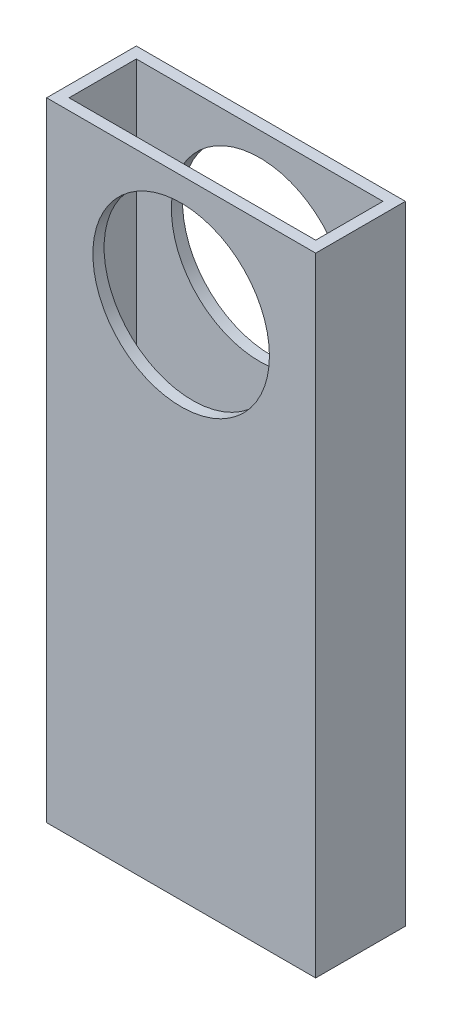
ISO-10303-21;
HEADER;
FILE_DESCRIPTION(('STEP AP214'),'2;1');
FILE_NAME('part.step','',(''),(''),'','','');
FILE_SCHEMA(('AUTOMOTIVE_DESIGN { 1 0 10303 214 1 1 1 1 }'));
ENDSEC;
DATA;
#1=APPLICATION_CONTEXT('core data for automotive mechanical design processes');
#2=APPLICATION_PROTOCOL_DEFINITION('international standard','automotive_design',2000,#1);
#3=PRODUCT_CONTEXT('',#1,'mechanical');
#4=PRODUCT('Part','Part','',(#3));
#5=PRODUCT_RELATED_PRODUCT_CATEGORY('part','',(#4));
#6=PRODUCT_DEFINITION_FORMATION('','',#4);
#7=PRODUCT_DEFINITION_CONTEXT('part definition',#1,'design');
#8=PRODUCT_DEFINITION('design','',#6,#7);
#9=PRODUCT_DEFINITION_SHAPE('','',#8);
#10=(LENGTH_UNIT() NAMED_UNIT(*) SI_UNIT(.MILLI.,.METRE.));
#11=(NAMED_UNIT(*) PLANE_ANGLE_UNIT() SI_UNIT($,.RADIAN.));
#12=(NAMED_UNIT(*) SI_UNIT($,.STERADIAN.) SOLID_ANGLE_UNIT());
#13=UNCERTAINTY_MEASURE_WITH_UNIT(LENGTH_MEASURE(1.E-05),#10,'distance_accuracy_value','');
#14=(GEOMETRIC_REPRESENTATION_CONTEXT(3) GLOBAL_UNCERTAINTY_ASSIGNED_CONTEXT((#13)) GLOBAL_UNIT_ASSIGNED_CONTEXT((#10,
#11,#12)) REPRESENTATION_CONTEXT('',''));
#15=CARTESIAN_POINT('',(0.,0.,0.));
#16=DIRECTION('',(0.,0.,1.));
#17=DIRECTION('',(1.,0.,0.));
#18=AXIS2_PLACEMENT_3D('',#15,#16,#17);
#19=CARTESIAN_POINT('',(0.,177.8,0.));
#20=DIRECTION('',(0.,1.,0.));
#21=DIRECTION('',(0.,0.,1.));
#22=AXIS2_PLACEMENT_3D('',#19,#20,#21);
#23=PLANE('',#22);
#24=DIRECTION('',(0.,0.,1.));
#25=VECTOR('',#24,1.);
#26=CARTESIAN_POINT('',(-38.1,177.8,12.7));
#27=LINE('',#26,#25);
#28=CARTESIAN_POINT('',(-38.1,177.8,-12.7));
#29=VERTEX_POINT('',#28);
#30=CARTESIAN_POINT('',(-38.1,177.8,12.7));
#31=VERTEX_POINT('',#30);
#32=EDGE_CURVE('E143',#29,#31,#27,.T.);
#33=ORIENTED_EDGE('',*,*,#32,.T.);
#34=DIRECTION('',(1.,0.,0.));
#35=VECTOR('',#34,1.);
#36=CARTESIAN_POINT('',(38.1,177.8,12.7));
#37=LINE('',#36,#35);
#38=CARTESIAN_POINT('',(38.1,177.8,12.7));
#39=VERTEX_POINT('',#38);
#40=EDGE_CURVE('E146',#31,#39,#37,.T.);
#41=ORIENTED_EDGE('',*,*,#40,.T.);
#42=DIRECTION('',(0.,0.,-1.));
#43=VECTOR('',#42,1.);
#44=CARTESIAN_POINT('',(38.1,177.8,12.7));
#45=LINE('',#44,#43);
#46=CARTESIAN_POINT('',(38.1,177.8,-12.7));
#47=VERTEX_POINT('',#46);
#48=EDGE_CURVE('E149',#39,#47,#45,.T.);
#49=ORIENTED_EDGE('',*,*,#48,.T.);
#50=DIRECTION('',(-1.,0.,0.));
#51=VECTOR('',#50,1.);
#52=CARTESIAN_POINT('',(38.1,177.8,-12.7));
#53=LINE('',#52,#51);
#54=EDGE_CURVE('E151',#47,#29,#53,.T.);
#55=ORIENTED_EDGE('',*,*,#54,.T.);
#56=EDGE_LOOP('',(#33,#41,#49,#55));
#57=FACE_BOUND('',#56,.T.);
#58=DIRECTION('',(-1.,0.,0.));
#59=VECTOR('',#58,1.);
#60=CARTESIAN_POINT('',(34.925,177.8,-9.52500000000001));
#61=LINE('',#60,#59);
#62=CARTESIAN_POINT('',(34.925,177.8,-9.52500000000001));
#63=VERTEX_POINT('',#62);
#64=CARTESIAN_POINT('',(-34.925,177.8,-9.525));
#65=VERTEX_POINT('',#64);
#66=EDGE_CURVE('E113',#63,#65,#61,.T.);
#67=ORIENTED_EDGE('',*,*,#66,.F.);
#68=DIRECTION('',(0.,0.,-1.));
#69=VECTOR('',#68,1.);
#70=CARTESIAN_POINT('',(34.925,177.8,9.52499999999999));
#71=LINE('',#70,#69);
#72=CARTESIAN_POINT('',(34.925,177.8,9.52499999999999));
#73=VERTEX_POINT('',#72);
#74=EDGE_CURVE('E105',#73,#63,#71,.T.);
#75=ORIENTED_EDGE('',*,*,#74,.F.);
#76=DIRECTION('',(1.,0.,0.));
#77=VECTOR('',#76,1.);
#78=CARTESIAN_POINT('',(34.925,177.8,9.52499999999999));
#79=LINE('',#78,#77);
#80=CARTESIAN_POINT('',(-34.925,177.8,9.525));
#81=VERTEX_POINT('',#80);
#82=EDGE_CURVE('E127',#81,#73,#79,.T.);
#83=ORIENTED_EDGE('',*,*,#82,.F.);
#84=DIRECTION('',(0.,0.,1.));
#85=VECTOR('',#84,1.);
#86=CARTESIAN_POINT('',(-34.925,177.8,9.525));
#87=LINE('',#86,#85);
#88=EDGE_CURVE('E125',#65,#81,#87,.T.);
#89=ORIENTED_EDGE('',*,*,#88,.F.);
#90=EDGE_LOOP('',(#67,#75,#83,#89));
#91=FACE_BOUND('',#90,.T.);
#92=ADVANCED_FACE('F39',(#57,#91),#23,.T.);
#93=CARTESIAN_POINT('',(0.,0.,0.));
#94=DIRECTION('',(0.,1.,0.));
#95=DIRECTION('',(0.,0.,1.));
#96=AXIS2_PLACEMENT_3D('',#93,#94,#95);
#97=PLANE('',#96);
#98=DIRECTION('',(0.,0.,1.));
#99=VECTOR('',#98,1.);
#100=CARTESIAN_POINT('',(-38.1,0.,12.7));
#101=LINE('',#100,#99);
#102=CARTESIAN_POINT('',(-38.1,0.,-12.7));
#103=VERTEX_POINT('',#102);
#104=CARTESIAN_POINT('',(-38.1,0.,12.7));
#105=VERTEX_POINT('',#104);
#106=EDGE_CURVE('E121',#103,#105,#101,.T.);
#107=ORIENTED_EDGE('',*,*,#106,.F.);
#108=DIRECTION('',(-1.,0.,0.));
#109=VECTOR('',#108,1.);
#110=CARTESIAN_POINT('',(38.1,0.,-12.7));
#111=LINE('',#110,#109);
#112=CARTESIAN_POINT('',(38.1,0.,-12.7));
#113=VERTEX_POINT('',#112);
#114=EDGE_CURVE('E147',#113,#103,#111,.T.);
#115=ORIENTED_EDGE('',*,*,#114,.F.);
#116=DIRECTION('',(0.,0.,-1.));
#117=VECTOR('',#116,1.);
#118=CARTESIAN_POINT('',(38.1,0.,12.7));
#119=LINE('',#118,#117);
#120=CARTESIAN_POINT('',(38.1,0.,12.7));
#121=VERTEX_POINT('',#120);
#122=EDGE_CURVE('E158',#121,#113,#119,.T.);
#123=ORIENTED_EDGE('',*,*,#122,.F.);
#124=DIRECTION('',(1.,0.,0.));
#125=VECTOR('',#124,1.);
#126=CARTESIAN_POINT('',(38.1,0.,12.7));
#127=LINE('',#126,#125);
#128=EDGE_CURVE('E156',#105,#121,#127,.T.);
#129=ORIENTED_EDGE('',*,*,#128,.F.);
#130=EDGE_LOOP('',(#107,#115,#123,#129));
#131=FACE_BOUND('',#130,.T.);
#132=DIRECTION('',(0.,0.,-1.));
#133=VECTOR('',#132,1.);
#134=CARTESIAN_POINT('',(34.925,0.,9.52499999999999));
#135=LINE('',#134,#133);
#136=CARTESIAN_POINT('',(34.925,0.,9.52499999999999));
#137=VERTEX_POINT('',#136);
#138=CARTESIAN_POINT('',(34.925,0.,-9.52500000000001));
#139=VERTEX_POINT('',#138);
#140=EDGE_CURVE('E63',#137,#139,#135,.T.);
#141=ORIENTED_EDGE('',*,*,#140,.T.);
#142=DIRECTION('',(-1.,0.,0.));
#143=VECTOR('',#142,1.);
#144=CARTESIAN_POINT('',(34.925,0.,-9.52500000000001));
#145=LINE('',#144,#143);
#146=CARTESIAN_POINT('',(-34.925,0.,-9.525));
#147=VERTEX_POINT('',#146);
#148=EDGE_CURVE('E120',#139,#147,#145,.T.);
#149=ORIENTED_EDGE('',*,*,#148,.T.);
#150=DIRECTION('',(0.,0.,1.));
#151=VECTOR('',#150,1.);
#152=CARTESIAN_POINT('',(-34.925,0.,9.525));
#153=LINE('',#152,#151);
#154=CARTESIAN_POINT('',(-34.925,0.,9.525));
#155=VERTEX_POINT('',#154);
#156=EDGE_CURVE('E135',#147,#155,#153,.T.);
#157=ORIENTED_EDGE('',*,*,#156,.T.);
#158=DIRECTION('',(1.,0.,0.));
#159=VECTOR('',#158,1.);
#160=CARTESIAN_POINT('',(34.925,0.,9.52499999999999));
#161=LINE('',#160,#159);
#162=EDGE_CURVE('E114',#155,#137,#161,.T.);
#163=ORIENTED_EDGE('',*,*,#162,.T.);
#164=EDGE_LOOP('',(#141,#149,#157,#163));
#165=FACE_BOUND('',#164,.T.);
#166=ADVANCED_FACE('F177',(#131,#165),#97,.F.);
#167=CARTESIAN_POINT('',(-38.1,177.8,12.7));
#168=DIRECTION('',(1.,0.,0.));
#169=DIRECTION('',(0.,0.,-1.));
#170=AXIS2_PLACEMENT_3D('',#167,#168,#169);
#171=PLANE('',#170);
#172=ORIENTED_EDGE('',*,*,#106,.T.);
#173=DIRECTION('',(0.,-1.,0.));
#174=VECTOR('',#173,1.);
#175=CARTESIAN_POINT('',(-38.1,177.8,12.7));
#176=LINE('',#175,#174);
#177=EDGE_CURVE('E11',#31,#105,#176,.T.);
#178=ORIENTED_EDGE('',*,*,#177,.F.);
#179=ORIENTED_EDGE('',*,*,#32,.F.);
#180=DIRECTION('',(0.,-1.,0.));
#181=VECTOR('',#180,1.);
#182=CARTESIAN_POINT('',(-38.1,177.8,-12.7));
#183=LINE('',#182,#181);
#184=EDGE_CURVE('E153',#29,#103,#183,.T.);
#185=ORIENTED_EDGE('',*,*,#184,.T.);
#186=EDGE_LOOP('',(#172,#178,#179,#185));
#187=FACE_BOUND('',#186,.T.);
#188=ADVANCED_FACE('F41',(#187),#171,.F.);
#189=CARTESIAN_POINT('',(38.1,177.8,12.7));
#190=DIRECTION('',(0.,0.,-1.));
#191=DIRECTION('',(-1.,0.,0.));
#192=AXIS2_PLACEMENT_3D('',#189,#190,#191);
#193=PLANE('',#192);
#194=CARTESIAN_POINT('',(0.,146.05,12.7));
#195=DIRECTION('',(0.,0.,1.));
#196=DIRECTION('',(1.,0.,0.));
#197=AXIS2_PLACEMENT_3D('',#194,#195,#196);
#198=CIRCLE('',#197,25.);
#199=CARTESIAN_POINT('',(25.,146.05,12.7));
#200=VERTEX_POINT('',#199);
#201=EDGE_CURVE('E214',#200,#200,#198,.T.);
#202=ORIENTED_EDGE('',*,*,#201,.F.);
#203=EDGE_LOOP('',(#202));
#204=FACE_BOUND('',#203,.T.);
#205=ORIENTED_EDGE('',*,*,#128,.T.);
#206=DIRECTION('',(0.,-1.,0.));
#207=VECTOR('',#206,1.);
#208=CARTESIAN_POINT('',(38.1,177.8,12.7));
#209=LINE('',#208,#207);
#210=EDGE_CURVE('E48',#39,#121,#209,.T.);
#211=ORIENTED_EDGE('',*,*,#210,.F.);
#212=ORIENTED_EDGE('',*,*,#40,.F.);
#213=ORIENTED_EDGE('',*,*,#177,.T.);
#214=EDGE_LOOP('',(#205,#211,#212,#213));
#215=FACE_BOUND('',#214,.T.);
#216=ADVANCED_FACE('F187',(#204,#215),#193,.F.);
#217=CARTESIAN_POINT('',(38.1,177.8,12.7));
#218=DIRECTION('',(-1.,0.,0.));
#219=DIRECTION('',(0.,0.,1.));
#220=AXIS2_PLACEMENT_3D('',#217,#218,#219);
#221=PLANE('',#220);
#222=ORIENTED_EDGE('',*,*,#122,.T.);
#223=DIRECTION('',(0.,-1.,0.));
#224=VECTOR('',#223,1.);
#225=CARTESIAN_POINT('',(38.1,177.8,-12.7));
#226=LINE('',#225,#224);
#227=EDGE_CURVE('E163',#47,#113,#226,.T.);
#228=ORIENTED_EDGE('',*,*,#227,.F.);
#229=ORIENTED_EDGE('',*,*,#48,.F.);
#230=ORIENTED_EDGE('',*,*,#210,.T.);
#231=EDGE_LOOP('',(#222,#228,#229,#230));
#232=FACE_BOUND('',#231,.T.);
#233=ADVANCED_FACE('F171',(#232),#221,.F.);
#234=CARTESIAN_POINT('',(38.1,177.8,-12.7));
#235=DIRECTION('',(0.,0.,1.));
#236=DIRECTION('',(1.,0.,0.));
#237=AXIS2_PLACEMENT_3D('',#234,#235,#236);
#238=PLANE('',#237);
#239=CARTESIAN_POINT('',(0.,146.05,-12.7));
#240=DIRECTION('',(0.,0.,1.));
#241=DIRECTION('',(1.,0.,0.));
#242=AXIS2_PLACEMENT_3D('',#239,#240,#241);
#243=CIRCLE('',#242,25.);
#244=CARTESIAN_POINT('',(25.,146.05,-12.7));
#245=VERTEX_POINT('',#244);
#246=EDGE_CURVE('E212',#245,#245,#243,.T.);
#247=ORIENTED_EDGE('',*,*,#246,.T.);
#248=EDGE_LOOP('',(#247));
#249=FACE_BOUND('',#248,.T.);
#250=ORIENTED_EDGE('',*,*,#114,.T.);
#251=ORIENTED_EDGE('',*,*,#184,.F.);
#252=ORIENTED_EDGE('',*,*,#54,.F.);
#253=ORIENTED_EDGE('',*,*,#227,.T.);
#254=EDGE_LOOP('',(#250,#251,#252,#253));
#255=FACE_BOUND('',#254,.T.);
#256=ADVANCED_FACE('F181',(#249,#255),#238,.F.);
#257=CARTESIAN_POINT('',(34.925,177.8,9.52499999999999));
#258=DIRECTION('',(-1.,0.,0.));
#259=DIRECTION('',(0.,0.,1.));
#260=AXIS2_PLACEMENT_3D('',#257,#258,#259);
#261=PLANE('',#260);
#262=ORIENTED_EDGE('',*,*,#140,.F.);
#263=DIRECTION('',(0.,-1.,0.));
#264=VECTOR('',#263,1.);
#265=CARTESIAN_POINT('',(34.925,177.8,9.52499999999999));
#266=LINE('',#265,#264);
#267=EDGE_CURVE('E109',#73,#137,#266,.T.);
#268=ORIENTED_EDGE('',*,*,#267,.F.);
#269=ORIENTED_EDGE('',*,*,#74,.T.);
#270=DIRECTION('',(0.,-1.,0.));
#271=VECTOR('',#270,1.);
#272=CARTESIAN_POINT('',(34.925,177.8,-9.52500000000001));
#273=LINE('',#272,#271);
#274=EDGE_CURVE('E108',#63,#139,#273,.T.);
#275=ORIENTED_EDGE('',*,*,#274,.T.);
#276=EDGE_LOOP('',(#262,#268,#269,#275));
#277=FACE_BOUND('',#276,.T.);
#278=ADVANCED_FACE('F107',(#277),#261,.T.);
#279=CARTESIAN_POINT('',(34.925,177.8,-9.52500000000001));
#280=DIRECTION('',(0.,0.,1.));
#281=DIRECTION('',(1.,0.,0.));
#282=AXIS2_PLACEMENT_3D('',#279,#280,#281);
#283=PLANE('',#282);
#284=CARTESIAN_POINT('',(0.,146.05,-9.525));
#285=DIRECTION('',(0.,0.,1.));
#286=DIRECTION('',(1.,0.,0.));
#287=AXIS2_PLACEMENT_3D('',#284,#285,#286);
#288=CIRCLE('',#287,25.);
#289=CARTESIAN_POINT('',(25.,146.05,-9.525));
#290=VERTEX_POINT('',#289);
#291=EDGE_CURVE('E133',#290,#290,#288,.T.);
#292=ORIENTED_EDGE('',*,*,#291,.F.);
#293=EDGE_LOOP('',(#292));
#294=FACE_BOUND('',#293,.T.);
#295=ORIENTED_EDGE('',*,*,#148,.F.);
#296=ORIENTED_EDGE('',*,*,#274,.F.);
#297=ORIENTED_EDGE('',*,*,#66,.T.);
#298=DIRECTION('',(0.,-1.,0.));
#299=VECTOR('',#298,1.);
#300=CARTESIAN_POINT('',(-34.925,177.8,-9.525));
#301=LINE('',#300,#299);
#302=EDGE_CURVE('E122',#65,#147,#301,.T.);
#303=ORIENTED_EDGE('',*,*,#302,.T.);
#304=EDGE_LOOP('',(#295,#296,#297,#303));
#305=FACE_BOUND('',#304,.T.);
#306=ADVANCED_FACE('F117',(#294,#305),#283,.T.);
#307=CARTESIAN_POINT('',(-34.925,177.8,9.525));
#308=DIRECTION('',(1.,0.,0.));
#309=DIRECTION('',(0.,0.,-1.));
#310=AXIS2_PLACEMENT_3D('',#307,#308,#309);
#311=PLANE('',#310);
#312=ORIENTED_EDGE('',*,*,#156,.F.);
#313=ORIENTED_EDGE('',*,*,#302,.F.);
#314=ORIENTED_EDGE('',*,*,#88,.T.);
#315=DIRECTION('',(0.,-1.,0.));
#316=VECTOR('',#315,1.);
#317=CARTESIAN_POINT('',(-34.925,177.8,9.525));
#318=LINE('',#317,#316);
#319=EDGE_CURVE('E55',#81,#155,#318,.T.);
#320=ORIENTED_EDGE('',*,*,#319,.T.);
#321=EDGE_LOOP('',(#312,#313,#314,#320));
#322=FACE_BOUND('',#321,.T.);
#323=ADVANCED_FACE('F225',(#322),#311,.T.);
#324=CARTESIAN_POINT('',(34.925,177.8,9.52499999999999));
#325=DIRECTION('',(0.,0.,-1.));
#326=DIRECTION('',(-1.,0.,0.));
#327=AXIS2_PLACEMENT_3D('',#324,#325,#326);
#328=PLANE('',#327);
#329=CARTESIAN_POINT('',(0.,146.05,9.525));
#330=DIRECTION('',(0.,0.,-1.));
#331=DIRECTION('',(-1.,0.,0.));
#332=AXIS2_PLACEMENT_3D('',#329,#330,#331);
#333=CIRCLE('',#332,25.);
#334=CARTESIAN_POINT('',(25.,146.05,9.525));
#335=VERTEX_POINT('',#334);
#336=EDGE_CURVE('E43',#335,#335,#333,.T.);
#337=ORIENTED_EDGE('',*,*,#336,.F.);
#338=EDGE_LOOP('',(#337));
#339=FACE_BOUND('',#338,.T.);
#340=ORIENTED_EDGE('',*,*,#162,.F.);
#341=ORIENTED_EDGE('',*,*,#319,.F.);
#342=ORIENTED_EDGE('',*,*,#82,.T.);
#343=ORIENTED_EDGE('',*,*,#267,.T.);
#344=EDGE_LOOP('',(#340,#341,#342,#343));
#345=FACE_BOUND('',#344,.T.);
#346=ADVANCED_FACE('F229',(#339,#345),#328,.T.);
#347=CARTESIAN_POINT('',(0.,146.05,-12.7));
#348=DIRECTION('',(0.,0.,1.));
#349=DIRECTION('',(1.,0.,0.));
#350=AXIS2_PLACEMENT_3D('',#347,#348,#349);
#351=CYLINDRICAL_SURFACE('',#350,25.);
#352=CARTESIAN_POINT('',(25.,146.05,9.525));
#353=CARTESIAN_POINT('',(25.,146.05,9.55807291666666));
#354=CARTESIAN_POINT('',(25.,146.05,9.59114583333333));
#355=CARTESIAN_POINT('',(25.,146.05,9.65729166666666));
#356=CARTESIAN_POINT('',(25.,146.05,9.69036458333333));
#357=CARTESIAN_POINT('',(25.,146.05,9.75651041666666));
#358=CARTESIAN_POINT('',(25.,146.05,9.78958333333333));
#359=CARTESIAN_POINT('',(25.,146.05,9.85572916666666));
#360=CARTESIAN_POINT('',(25.,146.05,9.88880208333333));
#361=CARTESIAN_POINT('',(25.,146.05,9.95494791666666));
#362=CARTESIAN_POINT('',(25.,146.05,9.98802083333333));
#363=CARTESIAN_POINT('',(25.,146.05,10.0541666666667));
#364=CARTESIAN_POINT('',(25.,146.05,10.0872395833333));
#365=CARTESIAN_POINT('',(25.,146.05,10.1533854166667));
#366=CARTESIAN_POINT('',(25.,146.05,10.1864583333333));
#367=CARTESIAN_POINT('',(25.,146.05,10.2526041666667));
#368=CARTESIAN_POINT('',(25.,146.05,10.2856770833333));
#369=CARTESIAN_POINT('',(25.,146.05,10.3518229166667));
#370=CARTESIAN_POINT('',(25.,146.05,10.3848958333333));
#371=CARTESIAN_POINT('',(25.,146.05,10.4510416666667));
#372=CARTESIAN_POINT('',(25.,146.05,10.4841145833333));
#373=CARTESIAN_POINT('',(25.,146.05,10.5502604166667));
#374=CARTESIAN_POINT('',(25.,146.05,10.5833333333333));
#375=CARTESIAN_POINT('',(25.,146.05,10.6494791666667));
#376=CARTESIAN_POINT('',(25.,146.05,10.6825520833333));
#377=CARTESIAN_POINT('',(25.,146.05,10.7486979166667));
#378=CARTESIAN_POINT('',(25.,146.05,10.7817708333333));
#379=CARTESIAN_POINT('',(25.,146.05,10.8479166666667));
#380=CARTESIAN_POINT('',(25.,146.05,10.8809895833333));
#381=CARTESIAN_POINT('',(25.,146.05,10.9471354166667));
#382=CARTESIAN_POINT('',(25.,146.05,10.9802083333333));
#383=CARTESIAN_POINT('',(25.,146.05,11.0463541666667));
#384=CARTESIAN_POINT('',(25.,146.05,11.0794270833333));
#385=CARTESIAN_POINT('',(25.,146.05,11.1455729166667));
#386=CARTESIAN_POINT('',(25.,146.05,11.1786458333333));
#387=CARTESIAN_POINT('',(25.,146.05,11.2447916666667));
#388=CARTESIAN_POINT('',(25.,146.05,11.2778645833333));
#389=CARTESIAN_POINT('',(25.,146.05,11.3440104166667));
#390=CARTESIAN_POINT('',(25.,146.05,11.3770833333333));
#391=CARTESIAN_POINT('',(25.,146.05,11.4432291666667));
#392=CARTESIAN_POINT('',(25.,146.05,11.4763020833333));
#393=CARTESIAN_POINT('',(25.,146.05,11.5424479166667));
#394=CARTESIAN_POINT('',(25.,146.05,11.5755208333333));
#395=CARTESIAN_POINT('',(25.,146.05,11.6416666666667));
#396=CARTESIAN_POINT('',(25.,146.05,11.6747395833333));
#397=CARTESIAN_POINT('',(25.,146.05,11.7408854166667));
#398=CARTESIAN_POINT('',(25.,146.05,11.7739583333333));
#399=CARTESIAN_POINT('',(25.,146.05,11.8401041666667));
#400=CARTESIAN_POINT('',(25.,146.05,11.8731770833333));
#401=CARTESIAN_POINT('',(25.,146.05,11.9393229166667));
#402=CARTESIAN_POINT('',(25.,146.05,11.9723958333333));
#403=CARTESIAN_POINT('',(25.,146.05,12.0385416666667));
#404=CARTESIAN_POINT('',(25.,146.05,12.0716145833333));
#405=CARTESIAN_POINT('',(25.,146.05,12.1377604166667));
#406=CARTESIAN_POINT('',(25.,146.05,12.1708333333333));
#407=CARTESIAN_POINT('',(25.,146.05,12.2369791666667));
#408=CARTESIAN_POINT('',(25.,146.05,12.2700520833333));
#409=CARTESIAN_POINT('',(25.,146.05,12.3361979166667));
#410=CARTESIAN_POINT('',(25.,146.05,12.3692708333333));
#411=CARTESIAN_POINT('',(25.,146.05,12.4354166666667));
#412=CARTESIAN_POINT('',(25.,146.05,12.4684895833333));
#413=CARTESIAN_POINT('',(25.,146.05,12.5346354166667));
#414=CARTESIAN_POINT('',(25.,146.05,12.5677083333333));
#415=CARTESIAN_POINT('',(25.,146.05,12.6338541666667));
#416=CARTESIAN_POINT('',(25.,146.05,12.6669270833333));
#417=CARTESIAN_POINT('',(25.,146.05,12.7));
#418=B_SPLINE_CURVE_WITH_KNOTS('',3,(#352,#353,#354,#355,#356,#357,#358,#359,#360,#361,#362,
#363,#364,#365,#366,#367,#368,#369,#370,#371,#372,#373,#374,#375,#376,#377,#378,#379,#380,#381,
#382,#383,#384,#385,#386,#387,#388,#389,#390,#391,#392,#393,#394,#395,#396,#397,#398,#399,#400,
#401,#402,#403,#404,#405,#406,#407,#408,#409,#410,#411,#412,#413,#414,#415,#416,#417),
.UNSPECIFIED.,.F.,.F.,(4,2,2,2,2,2,2,2,2,2,2,2,2,2,2,2,2,2,2,2,2,2,2,2,2,2,2,2,2,2,2,2,4),(0.,
0.0992187500000012,0.198437499999999,0.29765625,0.396874999999998,0.496093749999999,0.5953125,
0.694531249999998,0.793749999999999,0.892968750000001,0.992187499999998,1.09140625,1.190625,
1.28984375,1.3890625,1.48828125,1.5875,1.68671875,1.7859375,1.88515625,1.984375,2.08359375,
2.1828125,2.28203125,2.38125,2.48046875,2.5796875,2.67890625,2.778125,2.87734375,2.9765625,
3.07578125,3.175),.UNSPECIFIED.);
#419=EDGE_CURVE('BSEAM235',#335,#200,#418,.T.);
#420=ORIENTED_EDGE('',*,*,#336,.T.);
#421=ORIENTED_EDGE('',*,*,#201,.T.);
#422=ORIENTED_EDGE('',*,*,#419,.T.);
#423=ORIENTED_EDGE('',*,*,#419,.F.);
#424=EDGE_LOOP('',(#420,#422,#421,#423));
#425=FACE_BOUND('',#424,.T.);
#426=ADVANCED_FACE('F235',(#425),#351,.F.);
#427=CARTESIAN_POINT('',(25.,146.05,-9.525));
#428=CARTESIAN_POINT('',(25.,146.05,-9.55807291666667));
#429=CARTESIAN_POINT('',(25.,146.05,-9.59114583333334));
#430=CARTESIAN_POINT('',(25.,146.05,-9.65729166666667));
#431=CARTESIAN_POINT('',(25.,146.05,-9.69036458333334));
#432=CARTESIAN_POINT('',(25.,146.05,-9.75651041666667));
#433=CARTESIAN_POINT('',(25.,146.05,-9.78958333333334));
#434=CARTESIAN_POINT('',(25.,146.05,-9.85572916666667));
#435=CARTESIAN_POINT('',(25.,146.05,-9.88880208333334));
#436=CARTESIAN_POINT('',(25.,146.05,-9.95494791666667));
#437=CARTESIAN_POINT('',(25.,146.05,-9.98802083333334));
#438=CARTESIAN_POINT('',(25.,146.05,-10.0541666666667));
#439=CARTESIAN_POINT('',(25.,146.05,-10.0872395833333));
#440=CARTESIAN_POINT('',(25.,146.05,-10.1533854166667));
#441=CARTESIAN_POINT('',(25.,146.05,-10.1864583333333));
#442=CARTESIAN_POINT('',(25.,146.05,-10.2526041666667));
#443=CARTESIAN_POINT('',(25.,146.05,-10.2856770833333));
#444=CARTESIAN_POINT('',(25.,146.05,-10.3518229166667));
#445=CARTESIAN_POINT('',(25.,146.05,-10.3848958333333));
#446=CARTESIAN_POINT('',(25.,146.05,-10.4510416666667));
#447=CARTESIAN_POINT('',(25.,146.05,-10.4841145833333));
#448=CARTESIAN_POINT('',(25.,146.05,-10.5502604166667));
#449=CARTESIAN_POINT('',(25.,146.05,-10.5833333333333));
#450=CARTESIAN_POINT('',(25.,146.05,-10.6494791666667));
#451=CARTESIAN_POINT('',(25.,146.05,-10.6825520833333));
#452=CARTESIAN_POINT('',(25.,146.05,-10.7486979166667));
#453=CARTESIAN_POINT('',(25.,146.05,-10.7817708333333));
#454=CARTESIAN_POINT('',(25.,146.05,-10.8479166666667));
#455=CARTESIAN_POINT('',(25.,146.05,-10.8809895833333));
#456=CARTESIAN_POINT('',(25.,146.05,-10.9471354166667));
#457=CARTESIAN_POINT('',(25.,146.05,-10.9802083333333));
#458=CARTESIAN_POINT('',(25.,146.05,-11.0463541666667));
#459=CARTESIAN_POINT('',(25.,146.05,-11.0794270833333));
#460=CARTESIAN_POINT('',(25.,146.05,-11.1455729166667));
#461=CARTESIAN_POINT('',(25.,146.05,-11.1786458333333));
#462=CARTESIAN_POINT('',(25.,146.05,-11.2447916666667));
#463=CARTESIAN_POINT('',(25.,146.05,-11.2778645833333));
#464=CARTESIAN_POINT('',(25.,146.05,-11.3440104166667));
#465=CARTESIAN_POINT('',(25.,146.05,-11.3770833333333));
#466=CARTESIAN_POINT('',(25.,146.05,-11.4432291666667));
#467=CARTESIAN_POINT('',(25.,146.05,-11.4763020833333));
#468=CARTESIAN_POINT('',(25.,146.05,-11.5424479166667));
#469=CARTESIAN_POINT('',(25.,146.05,-11.5755208333333));
#470=CARTESIAN_POINT('',(25.,146.05,-11.6416666666667));
#471=CARTESIAN_POINT('',(25.,146.05,-11.6747395833333));
#472=CARTESIAN_POINT('',(25.,146.05,-11.7408854166667));
#473=CARTESIAN_POINT('',(25.,146.05,-11.7739583333333));
#474=CARTESIAN_POINT('',(25.,146.05,-11.8401041666667));
#475=CARTESIAN_POINT('',(25.,146.05,-11.8731770833333));
#476=CARTESIAN_POINT('',(25.,146.05,-11.9393229166667));
#477=CARTESIAN_POINT('',(25.,146.05,-11.9723958333333));
#478=CARTESIAN_POINT('',(25.,146.05,-12.0385416666667));
#479=CARTESIAN_POINT('',(25.,146.05,-12.0716145833333));
#480=CARTESIAN_POINT('',(25.,146.05,-12.1377604166667));
#481=CARTESIAN_POINT('',(25.,146.05,-12.1708333333333));
#482=CARTESIAN_POINT('',(25.,146.05,-12.2369791666667));
#483=CARTESIAN_POINT('',(25.,146.05,-12.2700520833333));
#484=CARTESIAN_POINT('',(25.,146.05,-12.3361979166667));
#485=CARTESIAN_POINT('',(25.,146.05,-12.3692708333333));
#486=CARTESIAN_POINT('',(25.,146.05,-12.4354166666667));
#487=CARTESIAN_POINT('',(25.,146.05,-12.4684895833333));
#488=CARTESIAN_POINT('',(25.,146.05,-12.5346354166667));
#489=CARTESIAN_POINT('',(25.,146.05,-12.5677083333333));
#490=CARTESIAN_POINT('',(25.,146.05,-12.6338541666667));
#491=CARTESIAN_POINT('',(25.,146.05,-12.6669270833333));
#492=CARTESIAN_POINT('',(25.,146.05,-12.7));
#493=B_SPLINE_CURVE_WITH_KNOTS('',3,(#427,#428,#429,#430,#431,#432,#433,#434,#435,#436,#437,
#438,#439,#440,#441,#442,#443,#444,#445,#446,#447,#448,#449,#450,#451,#452,#453,#454,#455,#456,
#457,#458,#459,#460,#461,#462,#463,#464,#465,#466,#467,#468,#469,#470,#471,#472,#473,#474,#475,
#476,#477,#478,#479,#480,#481,#482,#483,#484,#485,#486,#487,#488,#489,#490,#491,#492),
.UNSPECIFIED.,.F.,.F.,(4,2,2,2,2,2,2,2,2,2,2,2,2,2,2,2,2,2,2,2,2,2,2,2,2,2,2,2,2,2,2,2,4),(0.,
0.0992187500000012,0.198437500000001,0.297656250000002,0.396875000000001,0.496093750000001,
0.595312500000002,0.694531250000002,0.793750000000001,0.892968750000002,0.992187500000002,
1.09140625,1.190625,1.28984375,1.3890625,1.48828125,1.5875,1.68671875,1.7859375,1.88515625,
1.984375,2.08359375,2.1828125,2.28203125,2.38125,2.48046875,2.5796875,2.67890625000001,2.778125,
2.87734375,2.97656250000001,3.07578125,3.175),.UNSPECIFIED.);
#494=EDGE_CURVE('BSEAM222',#290,#245,#493,.T.);
#495=ORIENTED_EDGE('',*,*,#291,.T.);
#496=ORIENTED_EDGE('',*,*,#246,.F.);
#497=ORIENTED_EDGE('',*,*,#494,.T.);
#498=ORIENTED_EDGE('',*,*,#494,.F.);
#499=EDGE_LOOP('',(#495,#497,#496,#498));
#500=FACE_BOUND('',#499,.T.);
#501=ADVANCED_FACE('F222',(#500),#351,.F.);
#502=CLOSED_SHELL('',(#92,#166,#188,#216,#233,#256,#278,#306,#323,#346,#426,#501));
#503=MANIFOLD_SOLID_BREP('B2',#502);
#504=ADVANCED_BREP_SHAPE_REPRESENTATION('',(#18,#503),#14);
#505=SHAPE_DEFINITION_REPRESENTATION(#9,#504);
ENDSEC;
END-ISO-10303-21;
